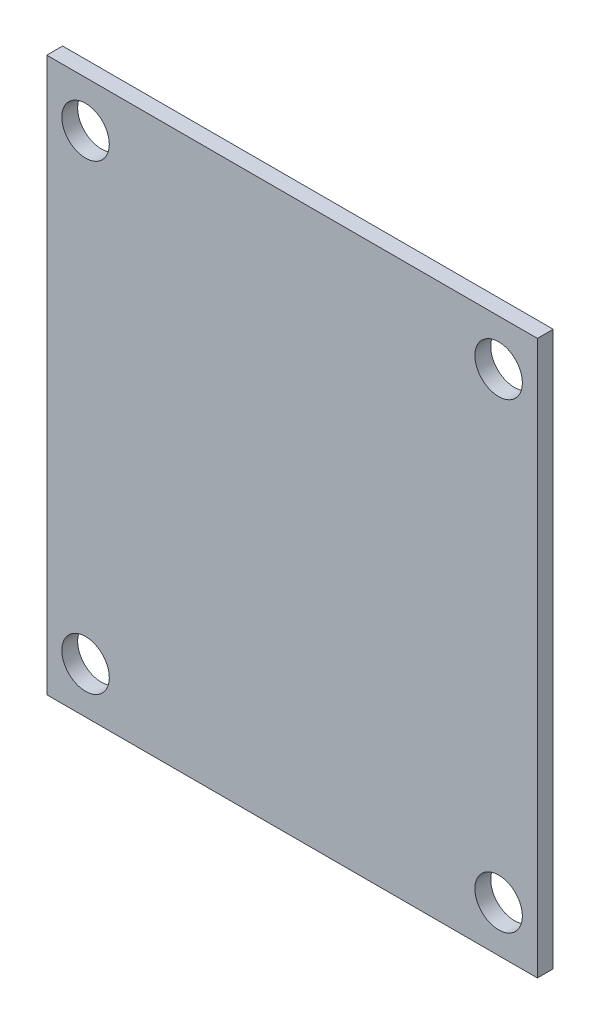
ISO-10303-21;
HEADER;
FILE_DESCRIPTION(('STEP AP214'),'2;1');
FILE_NAME('part.step','',(''),(''),'','','');
FILE_SCHEMA(('AUTOMOTIVE_DESIGN { 1 0 10303 214 1 1 1 1 }'));
ENDSEC;
DATA;
#1=APPLICATION_CONTEXT('core data for automotive mechanical design processes');
#2=APPLICATION_PROTOCOL_DEFINITION('international standard','automotive_design',2000,#1);
#3=PRODUCT_CONTEXT('',#1,'mechanical');
#4=PRODUCT('Part','Part','',(#3));
#5=PRODUCT_RELATED_PRODUCT_CATEGORY('part','',(#4));
#6=PRODUCT_DEFINITION_FORMATION('','',#4);
#7=PRODUCT_DEFINITION_CONTEXT('part definition',#1,'design');
#8=PRODUCT_DEFINITION('design','',#6,#7);
#9=PRODUCT_DEFINITION_SHAPE('','',#8);
#10=(LENGTH_UNIT() NAMED_UNIT(*) SI_UNIT(.MILLI.,.METRE.));
#11=(NAMED_UNIT(*) PLANE_ANGLE_UNIT() SI_UNIT($,.RADIAN.));
#12=(NAMED_UNIT(*) SI_UNIT($,.STERADIAN.) SOLID_ANGLE_UNIT());
#13=UNCERTAINTY_MEASURE_WITH_UNIT(LENGTH_MEASURE(1.E-05),#10,'distance_accuracy_value','');
#14=(GEOMETRIC_REPRESENTATION_CONTEXT(3) GLOBAL_UNCERTAINTY_ASSIGNED_CONTEXT((#13)) GLOBAL_UNIT_ASSIGNED_CONTEXT((#10,
#11,#12)) REPRESENTATION_CONTEXT('',''));
#15=CARTESIAN_POINT('',(0.,0.,0.));
#16=DIRECTION('',(0.,0.,1.));
#17=DIRECTION('',(1.,0.,0.));
#18=AXIS2_PLACEMENT_3D('',#15,#16,#17);
#19=CARTESIAN_POINT('',(0.,0.,1.));
#20=DIRECTION('',(0.,0.,1.));
#21=DIRECTION('',(1.,0.,0.));
#22=AXIS2_PLACEMENT_3D('',#19,#20,#21);
#23=PLANE('',#22);
#24=CARTESIAN_POINT('',(44.8200790405273,33.9269906616211,1.));
#25=DIRECTION('',(0.,0.,1.));
#26=DIRECTION('',(1.,0.,0.));
#27=AXIS2_PLACEMENT_3D('',#24,#25,#26);
#28=CIRCLE('',#27,1.5);
#29=CARTESIAN_POINT('',(46.3200790405273,33.9269906616211,1.));
#30=VERTEX_POINT('',#29);
#31=EDGE_CURVE('E125',#30,#30,#28,.T.);
#32=ORIENTED_EDGE('',*,*,#31,.F.);
#33=EDGE_LOOP('',(#32));
#34=FACE_BOUND('',#33,.T.);
#35=CARTESIAN_POINT('',(44.8200790405273,63.1069906616211,1.));
#36=DIRECTION('',(0.,0.,1.));
#37=DIRECTION('',(1.,0.,0.));
#38=AXIS2_PLACEMENT_3D('',#35,#36,#37);
#39=CIRCLE('',#38,1.5);
#40=CARTESIAN_POINT('',(46.3200790405273,63.1069906616211,1.));
#41=VERTEX_POINT('',#40);
#42=EDGE_CURVE('E104',#41,#41,#39,.T.);
#43=ORIENTED_EDGE('',*,*,#42,.F.);
#44=EDGE_LOOP('',(#43));
#45=FACE_BOUND('',#44,.T.);
#46=DIRECTION('',(0.,-1.,0.));
#47=VECTOR('',#46,1.);
#48=CARTESIAN_POINT('',(42.3700790405273,66.0169906616211,1.));
#49=LINE('',#48,#47);
#50=CARTESIAN_POINT('',(42.3700790405273,66.0169906616211,1.));
#51=VERTEX_POINT('',#50);
#52=CARTESIAN_POINT('',(42.3700790405273,31.0169906616211,1.));
#53=VERTEX_POINT('',#52);
#54=EDGE_CURVE('E89',#51,#53,#49,.T.);
#55=ORIENTED_EDGE('',*,*,#54,.T.);
#56=DIRECTION('',(1.,0.,0.));
#57=VECTOR('',#56,1.);
#58=CARTESIAN_POINT('',(42.3700790405273,31.0169906616211,1.));
#59=LINE('',#58,#57);
#60=CARTESIAN_POINT('',(73.3700790405273,31.0169906616211,1.));
#61=VERTEX_POINT('',#60);
#62=EDGE_CURVE('E84',#53,#61,#59,.T.);
#63=ORIENTED_EDGE('',*,*,#62,.T.);
#64=DIRECTION('',(0.,1.,0.));
#65=VECTOR('',#64,1.);
#66=CARTESIAN_POINT('',(73.3700790405273,66.0169906616211,1.));
#67=LINE('',#66,#65);
#68=CARTESIAN_POINT('',(73.3700790405273,66.0169906616211,1.));
#69=VERTEX_POINT('',#68);
#70=EDGE_CURVE('E87',#61,#69,#67,.T.);
#71=ORIENTED_EDGE('',*,*,#70,.T.);
#72=DIRECTION('',(-1.,0.,0.));
#73=VECTOR('',#72,1.);
#74=CARTESIAN_POINT('',(42.3700790405273,66.0169906616211,1.));
#75=LINE('',#74,#73);
#76=EDGE_CURVE('E54',#69,#51,#75,.T.);
#77=ORIENTED_EDGE('',*,*,#76,.T.);
#78=EDGE_LOOP('',(#55,#63,#71,#77));
#79=FACE_BOUND('',#78,.T.);
#80=CARTESIAN_POINT('',(70.9200790405273,63.1069906616211,1.));
#81=DIRECTION('',(0.,0.,1.));
#82=DIRECTION('',(1.,0.,0.));
#83=AXIS2_PLACEMENT_3D('',#80,#81,#82);
#84=CIRCLE('',#83,1.5);
#85=CARTESIAN_POINT('',(72.4200790405273,63.1069906616211,1.));
#86=VERTEX_POINT('',#85);
#87=EDGE_CURVE('E119',#86,#86,#84,.T.);
#88=ORIENTED_EDGE('',*,*,#87,.F.);
#89=EDGE_LOOP('',(#88));
#90=FACE_BOUND('',#89,.T.);
#91=CARTESIAN_POINT('',(70.9200790405273,33.9269906616211,1.));
#92=DIRECTION('',(0.,0.,1.));
#93=DIRECTION('',(1.,0.,0.));
#94=AXIS2_PLACEMENT_3D('',#91,#92,#93);
#95=CIRCLE('',#94,1.5);
#96=CARTESIAN_POINT('',(72.4200790405273,33.9269906616211,1.));
#97=VERTEX_POINT('',#96);
#98=EDGE_CURVE('E131',#97,#97,#95,.T.);
#99=ORIENTED_EDGE('',*,*,#98,.F.);
#100=EDGE_LOOP('',(#99));
#101=FACE_BOUND('',#100,.T.);
#102=ADVANCED_FACE('F37',(#34,#45,#79,#90,#101),#23,.T.);
#103=CARTESIAN_POINT('',(0.,0.,0.));
#104=DIRECTION('',(0.,0.,1.));
#105=DIRECTION('',(1.,0.,0.));
#106=AXIS2_PLACEMENT_3D('',#103,#104,#105);
#107=PLANE('',#106);
#108=DIRECTION('',(0.,-1.,0.));
#109=VECTOR('',#108,1.);
#110=CARTESIAN_POINT('',(42.3700790405273,66.0169906616211,0.));
#111=LINE('',#110,#109);
#112=CARTESIAN_POINT('',(42.3700790405273,66.0169906616211,0.));
#113=VERTEX_POINT('',#112);
#114=CARTESIAN_POINT('',(42.3700790405273,31.0169906616211,0.));
#115=VERTEX_POINT('',#114);
#116=EDGE_CURVE('E101',#113,#115,#111,.T.);
#117=ORIENTED_EDGE('',*,*,#116,.F.);
#118=DIRECTION('',(-1.,0.,0.));
#119=VECTOR('',#118,1.);
#120=CARTESIAN_POINT('',(42.3700790405273,66.0169906616211,0.));
#121=LINE('',#120,#119);
#122=CARTESIAN_POINT('',(73.3700790405273,66.0169906616211,0.));
#123=VERTEX_POINT('',#122);
#124=EDGE_CURVE('E77',#123,#113,#121,.T.);
#125=ORIENTED_EDGE('',*,*,#124,.F.);
#126=DIRECTION('',(0.,1.,0.));
#127=VECTOR('',#126,1.);
#128=CARTESIAN_POINT('',(73.3700790405273,66.0169906616211,0.));
#129=LINE('',#128,#127);
#130=CARTESIAN_POINT('',(73.3700790405273,31.0169906616211,0.));
#131=VERTEX_POINT('',#130);
#132=EDGE_CURVE('E71',#131,#123,#129,.T.);
#133=ORIENTED_EDGE('',*,*,#132,.F.);
#134=DIRECTION('',(1.,0.,0.));
#135=VECTOR('',#134,1.);
#136=CARTESIAN_POINT('',(42.3700790405273,31.0169906616211,0.));
#137=LINE('',#136,#135);
#138=EDGE_CURVE('E93',#115,#131,#137,.T.);
#139=ORIENTED_EDGE('',*,*,#138,.F.);
#140=EDGE_LOOP('',(#117,#125,#133,#139));
#141=FACE_BOUND('',#140,.T.);
#142=CARTESIAN_POINT('',(44.8200790405273,63.1069906616211,0.));
#143=DIRECTION('',(0.,0.,1.));
#144=DIRECTION('',(1.,0.,0.));
#145=AXIS2_PLACEMENT_3D('',#142,#143,#144);
#146=CIRCLE('',#145,1.5);
#147=CARTESIAN_POINT('',(46.3200790405273,63.1069906616211,0.));
#148=VERTEX_POINT('',#147);
#149=EDGE_CURVE('E116',#148,#148,#146,.T.);
#150=ORIENTED_EDGE('',*,*,#149,.T.);
#151=EDGE_LOOP('',(#150));
#152=FACE_BOUND('',#151,.T.);
#153=CARTESIAN_POINT('',(70.9200790405273,63.1069906616211,0.));
#154=DIRECTION('',(0.,0.,1.));
#155=DIRECTION('',(1.,0.,0.));
#156=AXIS2_PLACEMENT_3D('',#153,#154,#155);
#157=CIRCLE('',#156,1.5);
#158=CARTESIAN_POINT('',(72.4200790405273,63.1069906616211,0.));
#159=VERTEX_POINT('',#158);
#160=EDGE_CURVE('E122',#159,#159,#157,.T.);
#161=ORIENTED_EDGE('',*,*,#160,.T.);
#162=EDGE_LOOP('',(#161));
#163=FACE_BOUND('',#162,.T.);
#164=CARTESIAN_POINT('',(44.8200790405273,33.9269906616211,0.));
#165=DIRECTION('',(0.,0.,1.));
#166=DIRECTION('',(1.,0.,0.));
#167=AXIS2_PLACEMENT_3D('',#164,#165,#166);
#168=CIRCLE('',#167,1.5);
#169=CARTESIAN_POINT('',(46.3200790405273,33.9269906616211,0.));
#170=VERTEX_POINT('',#169);
#171=EDGE_CURVE('E128',#170,#170,#168,.T.);
#172=ORIENTED_EDGE('',*,*,#171,.T.);
#173=EDGE_LOOP('',(#172));
#174=FACE_BOUND('',#173,.T.);
#175=CARTESIAN_POINT('',(70.9200790405273,33.9269906616211,0.));
#176=DIRECTION('',(0.,0.,1.));
#177=DIRECTION('',(1.,0.,0.));
#178=AXIS2_PLACEMENT_3D('',#175,#176,#177);
#179=CIRCLE('',#178,1.5);
#180=CARTESIAN_POINT('',(72.4200790405273,33.9269906616211,0.));
#181=VERTEX_POINT('',#180);
#182=EDGE_CURVE('E134',#181,#181,#179,.T.);
#183=ORIENTED_EDGE('',*,*,#182,.T.);
#184=EDGE_LOOP('',(#183));
#185=FACE_BOUND('',#184,.T.);
#186=ADVANCED_FACE('F112',(#141,#152,#163,#174,#185),#107,.F.);
#187=CARTESIAN_POINT('',(42.3700790405273,66.0169906616211,1.));
#188=DIRECTION('',(1.,0.,0.));
#189=DIRECTION('',(0.,0.,-1.));
#190=AXIS2_PLACEMENT_3D('',#187,#188,#189);
#191=PLANE('',#190);
#192=ORIENTED_EDGE('',*,*,#116,.T.);
#193=DIRECTION('',(0.,0.,-1.));
#194=VECTOR('',#193,1.);
#195=CARTESIAN_POINT('',(42.3700790405273,31.0169906616211,1.));
#196=LINE('',#195,#194);
#197=EDGE_CURVE('E11',#53,#115,#196,.T.);
#198=ORIENTED_EDGE('',*,*,#197,.F.);
#199=ORIENTED_EDGE('',*,*,#54,.F.);
#200=DIRECTION('',(0.,0.,-1.));
#201=VECTOR('',#200,1.);
#202=CARTESIAN_POINT('',(42.3700790405273,66.0169906616211,1.));
#203=LINE('',#202,#201);
#204=EDGE_CURVE('E97',#51,#113,#203,.T.);
#205=ORIENTED_EDGE('',*,*,#204,.T.);
#206=EDGE_LOOP('',(#192,#198,#199,#205));
#207=FACE_BOUND('',#206,.T.);
#208=ADVANCED_FACE('F39',(#207),#191,.F.);
#209=CARTESIAN_POINT('',(42.3700790405273,31.0169906616211,1.));
#210=DIRECTION('',(0.,1.,0.));
#211=DIRECTION('',(0.,0.,1.));
#212=AXIS2_PLACEMENT_3D('',#209,#210,#211);
#213=PLANE('',#212);
#214=ORIENTED_EDGE('',*,*,#138,.T.);
#215=DIRECTION('',(0.,0.,-1.));
#216=VECTOR('',#215,1.);
#217=CARTESIAN_POINT('',(73.3700790405273,31.0169906616211,1.));
#218=LINE('',#217,#216);
#219=EDGE_CURVE('E46',#61,#131,#218,.T.);
#220=ORIENTED_EDGE('',*,*,#219,.F.);
#221=ORIENTED_EDGE('',*,*,#62,.F.);
#222=ORIENTED_EDGE('',*,*,#197,.T.);
#223=EDGE_LOOP('',(#214,#220,#221,#222));
#224=FACE_BOUND('',#223,.T.);
#225=ADVANCED_FACE('F92',(#224),#213,.F.);
#226=CARTESIAN_POINT('',(73.3700790405273,66.0169906616211,1.));
#227=DIRECTION('',(-1.,0.,0.));
#228=DIRECTION('',(0.,0.,1.));
#229=AXIS2_PLACEMENT_3D('',#226,#227,#228);
#230=PLANE('',#229);
#231=ORIENTED_EDGE('',*,*,#132,.T.);
#232=DIRECTION('',(0.,0.,-1.));
#233=VECTOR('',#232,1.);
#234=CARTESIAN_POINT('',(73.3700790405273,66.0169906616211,1.));
#235=LINE('',#234,#233);
#236=EDGE_CURVE('E94',#69,#123,#235,.T.);
#237=ORIENTED_EDGE('',*,*,#236,.F.);
#238=ORIENTED_EDGE('',*,*,#70,.F.);
#239=ORIENTED_EDGE('',*,*,#219,.T.);
#240=EDGE_LOOP('',(#231,#237,#238,#239));
#241=FACE_BOUND('',#240,.T.);
#242=ADVANCED_FACE('F95',(#241),#230,.F.);
#243=CARTESIAN_POINT('',(42.3700790405273,66.0169906616211,1.));
#244=DIRECTION('',(0.,-1.,0.));
#245=DIRECTION('',(0.,0.,-1.));
#246=AXIS2_PLACEMENT_3D('',#243,#244,#245);
#247=PLANE('',#246);
#248=ORIENTED_EDGE('',*,*,#124,.T.);
#249=ORIENTED_EDGE('',*,*,#204,.F.);
#250=ORIENTED_EDGE('',*,*,#76,.F.);
#251=ORIENTED_EDGE('',*,*,#236,.T.);
#252=EDGE_LOOP('',(#248,#249,#250,#251));
#253=FACE_BOUND('',#252,.T.);
#254=ADVANCED_FACE('F109',(#253),#247,.F.);
#255=CARTESIAN_POINT('',(44.8200790405273,63.1069906616211,1.));
#256=DIRECTION('',(0.,0.,-1.));
#257=DIRECTION('',(-1.,0.,0.));
#258=AXIS2_PLACEMENT_3D('',#255,#256,#257);
#259=CYLINDRICAL_SURFACE('',#258,1.5);
#260=ORIENTED_EDGE('',*,*,#42,.T.);
#261=EDGE_LOOP('',(#260));
#262=FACE_BOUND('',#261,.T.);
#263=ORIENTED_EDGE('',*,*,#149,.F.);
#264=EDGE_LOOP('',(#263));
#265=FACE_BOUND('',#264,.T.);
#266=ADVANCED_FACE('F153',(#262,#265),#259,.F.);
#267=CARTESIAN_POINT('',(70.9200790405273,63.1069906616211,1.));
#268=DIRECTION('',(0.,0.,-1.));
#269=DIRECTION('',(-1.,0.,0.));
#270=AXIS2_PLACEMENT_3D('',#267,#268,#269);
#271=CYLINDRICAL_SURFACE('',#270,1.5);
#272=ORIENTED_EDGE('',*,*,#87,.T.);
#273=EDGE_LOOP('',(#272));
#274=FACE_BOUND('',#273,.T.);
#275=ORIENTED_EDGE('',*,*,#160,.F.);
#276=EDGE_LOOP('',(#275));
#277=FACE_BOUND('',#276,.T.);
#278=ADVANCED_FACE('F199',(#274,#277),#271,.F.);
#279=CARTESIAN_POINT('',(44.8200790405273,33.9269906616211,1.));
#280=DIRECTION('',(0.,0.,-1.));
#281=DIRECTION('',(-1.,0.,0.));
#282=AXIS2_PLACEMENT_3D('',#279,#280,#281);
#283=CYLINDRICAL_SURFACE('',#282,1.5);
#284=ORIENTED_EDGE('',*,*,#31,.T.);
#285=EDGE_LOOP('',(#284));
#286=FACE_BOUND('',#285,.T.);
#287=ORIENTED_EDGE('',*,*,#171,.F.);
#288=EDGE_LOOP('',(#287));
#289=FACE_BOUND('',#288,.T.);
#290=ADVANCED_FACE('F207',(#286,#289),#283,.F.);
#291=CARTESIAN_POINT('',(70.9200790405273,33.9269906616211,1.));
#292=DIRECTION('',(0.,0.,-1.));
#293=DIRECTION('',(-1.,0.,0.));
#294=AXIS2_PLACEMENT_3D('',#291,#292,#293);
#295=CYLINDRICAL_SURFACE('',#294,1.5);
#296=ORIENTED_EDGE('',*,*,#98,.T.);
#297=EDGE_LOOP('',(#296));
#298=FACE_BOUND('',#297,.T.);
#299=ORIENTED_EDGE('',*,*,#182,.F.);
#300=EDGE_LOOP('',(#299));
#301=FACE_BOUND('',#300,.T.);
#302=ADVANCED_FACE('F140',(#298,#301),#295,.F.);
#303=CLOSED_SHELL('',(#102,#186,#208,#225,#242,#254,#266,#278,#290,#302));
#304=MANIFOLD_SOLID_BREP('B2',#303);
#305=ADVANCED_BREP_SHAPE_REPRESENTATION('',(#18,#304),#14);
#306=SHAPE_DEFINITION_REPRESENTATION(#9,#305);
ENDSEC;
END-ISO-10303-21;
